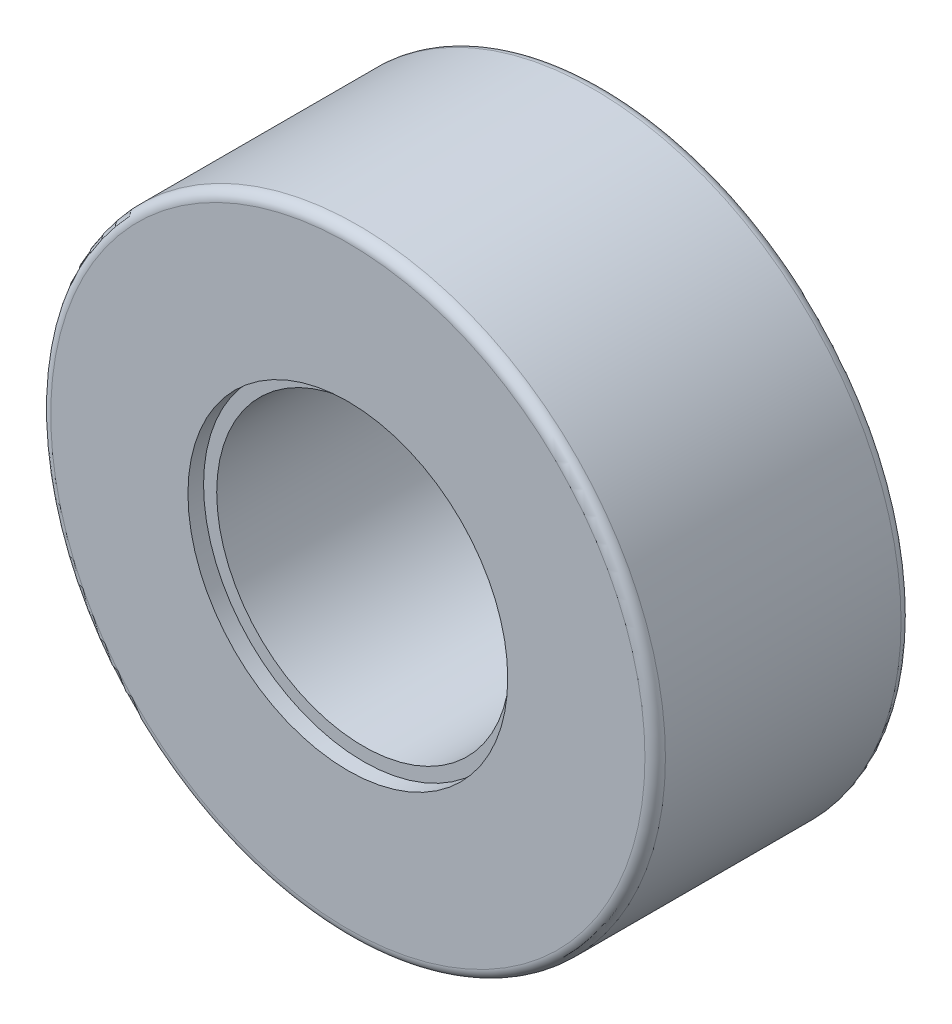
ISO-10303-21;
HEADER;
FILE_DESCRIPTION(('STEP AP214'),'2;1');
FILE_NAME('part.step','',(''),(''),'','','');
FILE_SCHEMA(('AUTOMOTIVE_DESIGN { 1 0 10303 214 1 1 1 1 }'));
ENDSEC;
DATA;
#1=APPLICATION_CONTEXT('core data for automotive mechanical design processes');
#2=APPLICATION_PROTOCOL_DEFINITION('international standard','automotive_design',2000,#1);
#3=PRODUCT_CONTEXT('',#1,'mechanical');
#4=PRODUCT('Part','Part','',(#3));
#5=PRODUCT_RELATED_PRODUCT_CATEGORY('part','',(#4));
#6=PRODUCT_DEFINITION_FORMATION('','',#4);
#7=PRODUCT_DEFINITION_CONTEXT('part definition',#1,'design');
#8=PRODUCT_DEFINITION('design','',#6,#7);
#9=PRODUCT_DEFINITION_SHAPE('','',#8);
#10=(LENGTH_UNIT() NAMED_UNIT(*) SI_UNIT(.MILLI.,.METRE.));
#11=(NAMED_UNIT(*) PLANE_ANGLE_UNIT() SI_UNIT($,.RADIAN.));
#12=(NAMED_UNIT(*) SI_UNIT($,.STERADIAN.) SOLID_ANGLE_UNIT());
#13=UNCERTAINTY_MEASURE_WITH_UNIT(LENGTH_MEASURE(1.E-05),#10,'distance_accuracy_value','');
#14=(GEOMETRIC_REPRESENTATION_CONTEXT(3) GLOBAL_UNCERTAINTY_ASSIGNED_CONTEXT((#13)) GLOBAL_UNIT_ASSIGNED_CONTEXT((#10,
#11,#12)) REPRESENTATION_CONTEXT('',''));
#15=CARTESIAN_POINT('',(0.,0.,0.));
#16=DIRECTION('',(0.,0.,1.));
#17=DIRECTION('',(1.,0.,0.));
#18=AXIS2_PLACEMENT_3D('',#15,#16,#17);
#19=CARTESIAN_POINT('',(0.,0.,12.5));
#20=DIRECTION('',(0.,0.,-1.));
#21=DIRECTION('',(-1.,0.,0.));
#22=AXIS2_PLACEMENT_3D('',#19,#20,#21);
#23=CYLINDRICAL_SURFACE('',#22,14.325);
#24=CARTESIAN_POINT('',(0.,0.,10.976));
#25=DIRECTION('',(0.,0.,1.));
#26=DIRECTION('',(1.,0.,0.));
#27=AXIS2_PLACEMENT_3D('',#24,#25,#26);
#28=CIRCLE('',#27,14.325);
#29=CARTESIAN_POINT('',(14.325,0.,10.976));
#30=VERTEX_POINT('',#29);
#31=EDGE_CURVE('E50',#30,#30,#28,.T.);
#32=ORIENTED_EDGE('',*,*,#31,.T.);
#33=EDGE_LOOP('',(#32));
#34=FACE_BOUND('',#33,.T.);
#35=CARTESIAN_POINT('',(0.,0.,-10.976));
#36=DIRECTION('',(0.,0.,-1.));
#37=DIRECTION('',(-1.,0.,0.));
#38=AXIS2_PLACEMENT_3D('',#35,#36,#37);
#39=CIRCLE('',#38,14.325);
#40=CARTESIAN_POINT('',(-14.325,0.,-10.976));
#41=VERTEX_POINT('',#40);
#42=EDGE_CURVE('E51',#41,#41,#39,.T.);
#43=ORIENTED_EDGE('',*,*,#42,.T.);
#44=EDGE_LOOP('',(#43));
#45=FACE_BOUND('',#44,.T.);
#46=ADVANCED_FACE('F30',(#34,#45),#23,.F.);
#47=CARTESIAN_POINT('',(0.,0.,12.5));
#48=DIRECTION('',(0.,0.,1.));
#49=DIRECTION('',(1.,0.,0.));
#50=AXIS2_PLACEMENT_3D('',#47,#48,#49);
#51=PLANE('',#50);
#52=CARTESIAN_POINT('',(0.,0.,12.5));
#53=DIRECTION('',(0.,0.,1.));
#54=DIRECTION('',(1.,0.,0.));
#55=AXIS2_PLACEMENT_3D('',#52,#53,#54);
#56=CIRCLE('',#55,29.);
#57=CARTESIAN_POINT('',(29.,0.,12.5));
#58=VERTEX_POINT('',#57);
#59=EDGE_CURVE('E10',#58,#58,#56,.T.);
#60=ORIENTED_EDGE('',*,*,#59,.T.);
#61=EDGE_LOOP('',(#60));
#62=FACE_BOUND('',#61,.T.);
#63=CARTESIAN_POINT('',(0.,0.,12.5));
#64=DIRECTION('',(0.,0.,1.));
#65=DIRECTION('',(1.,0.,0.));
#66=AXIS2_PLACEMENT_3D('',#63,#64,#65);
#67=CIRCLE('',#66,15.6075);
#68=CARTESIAN_POINT('',(15.6075,0.,12.5));
#69=VERTEX_POINT('',#68);
#70=EDGE_CURVE('E54',#69,#69,#67,.T.);
#71=ORIENTED_EDGE('',*,*,#70,.F.);
#72=EDGE_LOOP('',(#71));
#73=FACE_BOUND('',#72,.T.);
#74=ADVANCED_FACE('F86',(#62,#73),#51,.T.);
#75=CARTESIAN_POINT('',(0.,0.,-12.5));
#76=DIRECTION('',(0.,0.,1.));
#77=DIRECTION('',(1.,0.,0.));
#78=AXIS2_PLACEMENT_3D('',#75,#76,#77);
#79=PLANE('',#78);
#80=CARTESIAN_POINT('',(0.,0.,-12.5));
#81=DIRECTION('',(0.,0.,1.));
#82=DIRECTION('',(1.,0.,0.));
#83=AXIS2_PLACEMENT_3D('',#80,#81,#82);
#84=CIRCLE('',#83,29.);
#85=CARTESIAN_POINT('',(29.,0.,-12.5));
#86=VERTEX_POINT('',#85);
#87=EDGE_CURVE('E37',#86,#86,#84,.F.);
#88=ORIENTED_EDGE('',*,*,#87,.T.);
#89=EDGE_LOOP('',(#88));
#90=FACE_BOUND('',#89,.T.);
#91=CARTESIAN_POINT('',(0.,0.,-12.5));
#92=DIRECTION('',(0.,0.,1.));
#93=DIRECTION('',(1.,0.,0.));
#94=AXIS2_PLACEMENT_3D('',#91,#92,#93);
#95=CIRCLE('',#94,15.6075);
#96=CARTESIAN_POINT('',(-15.6075,0.,-12.5));
#97=VERTEX_POINT('',#96);
#98=EDGE_CURVE('E63',#97,#97,#95,.T.);
#99=ORIENTED_EDGE('',*,*,#98,.T.);
#100=EDGE_LOOP('',(#99));
#101=FACE_BOUND('',#100,.T.);
#102=ADVANCED_FACE('F92',(#90,#101),#79,.F.);
#103=CARTESIAN_POINT('',(0.,0.,12.5));
#104=DIRECTION('',(0.,0.,-1.));
#105=DIRECTION('',(-1.,0.,0.));
#106=AXIS2_PLACEMENT_3D('',#103,#104,#105);
#107=CYLINDRICAL_SURFACE('',#106,30.);
#108=CARTESIAN_POINT('',(0.,0.,-11.5));
#109=DIRECTION('',(0.,0.,1.));
#110=DIRECTION('',(1.,0.,0.));
#111=AXIS2_PLACEMENT_3D('',#108,#109,#110);
#112=CIRCLE('',#111,30.);
#113=CARTESIAN_POINT('',(30.,0.,-11.5));
#114=VERTEX_POINT('',#113);
#115=EDGE_CURVE('E41',#114,#114,#112,.T.);
#116=ORIENTED_EDGE('',*,*,#115,.T.);
#117=EDGE_LOOP('',(#116));
#118=FACE_BOUND('',#117,.T.);
#119=CARTESIAN_POINT('',(0.,0.,11.5));
#120=DIRECTION('',(0.,0.,1.));
#121=DIRECTION('',(1.,0.,0.));
#122=AXIS2_PLACEMENT_3D('',#119,#120,#121);
#123=CIRCLE('',#122,30.);
#124=CARTESIAN_POINT('',(30.,0.,11.5));
#125=VERTEX_POINT('',#124);
#126=EDGE_CURVE('E45',#125,#125,#123,.F.);
#127=ORIENTED_EDGE('',*,*,#126,.T.);
#128=EDGE_LOOP('',(#127));
#129=FACE_BOUND('',#128,.T.);
#130=ADVANCED_FACE('F101',(#118,#129),#107,.T.);
#131=CARTESIAN_POINT('',(0.,0.,10.976));
#132=DIRECTION('',(0.,0.,1.));
#133=DIRECTION('',(1.,0.,0.));
#134=AXIS2_PLACEMENT_3D('',#131,#132,#133);
#135=CYLINDRICAL_SURFACE('',#134,15.6075);
#136=CARTESIAN_POINT('',(0.,0.,10.976));
#137=DIRECTION('',(0.,0.,1.));
#138=DIRECTION('',(1.,0.,0.));
#139=AXIS2_PLACEMENT_3D('',#136,#137,#138);
#140=CIRCLE('',#139,15.6075);
#141=CARTESIAN_POINT('',(15.6075,0.,10.976));
#142=VERTEX_POINT('',#141);
#143=EDGE_CURVE('E58',#142,#142,#140,.T.);
#144=CARTESIAN_POINT('',(15.6075,0.,10.976));
#145=CARTESIAN_POINT('',(15.6075,0.,10.991875));
#146=CARTESIAN_POINT('',(15.6075,0.,11.00775));
#147=CARTESIAN_POINT('',(15.6075,0.,11.0395));
#148=CARTESIAN_POINT('',(15.6075,0.,11.055375));
#149=CARTESIAN_POINT('',(15.6075,0.,11.087125));
#150=CARTESIAN_POINT('',(15.6075,0.,11.103));
#151=CARTESIAN_POINT('',(15.6075,0.,11.13475));
#152=CARTESIAN_POINT('',(15.6075,0.,11.150625));
#153=CARTESIAN_POINT('',(15.6075,0.,11.182375));
#154=CARTESIAN_POINT('',(15.6075,0.,11.19825));
#155=CARTESIAN_POINT('',(15.6075,0.,11.23));
#156=CARTESIAN_POINT('',(15.6075,0.,11.245875));
#157=CARTESIAN_POINT('',(15.6075,0.,11.277625));
#158=CARTESIAN_POINT('',(15.6075,0.,11.2935));
#159=CARTESIAN_POINT('',(15.6075,0.,11.32525));
#160=CARTESIAN_POINT('',(15.6075,0.,11.341125));
#161=CARTESIAN_POINT('',(15.6075,0.,11.372875));
#162=CARTESIAN_POINT('',(15.6075,0.,11.38875));
#163=CARTESIAN_POINT('',(15.6075,0.,11.4205));
#164=CARTESIAN_POINT('',(15.6075,0.,11.436375));
#165=CARTESIAN_POINT('',(15.6075,0.,11.468125));
#166=CARTESIAN_POINT('',(15.6075,0.,11.484));
#167=CARTESIAN_POINT('',(15.6075,0.,11.51575));
#168=CARTESIAN_POINT('',(15.6075,0.,11.531625));
#169=CARTESIAN_POINT('',(15.6075,0.,11.563375));
#170=CARTESIAN_POINT('',(15.6075,0.,11.57925));
#171=CARTESIAN_POINT('',(15.6075,0.,11.611));
#172=CARTESIAN_POINT('',(15.6075,0.,11.626875));
#173=CARTESIAN_POINT('',(15.6075,0.,11.658625));
#174=CARTESIAN_POINT('',(15.6075,0.,11.6745));
#175=CARTESIAN_POINT('',(15.6075,0.,11.70625));
#176=CARTESIAN_POINT('',(15.6075,0.,11.722125));
#177=CARTESIAN_POINT('',(15.6075,0.,11.753875));
#178=CARTESIAN_POINT('',(15.6075,0.,11.76975));
#179=CARTESIAN_POINT('',(15.6075,0.,11.8015));
#180=CARTESIAN_POINT('',(15.6075,0.,11.817375));
#181=CARTESIAN_POINT('',(15.6075,0.,11.849125));
#182=CARTESIAN_POINT('',(15.6075,0.,11.865));
#183=CARTESIAN_POINT('',(15.6075,0.,11.89675));
#184=CARTESIAN_POINT('',(15.6075,0.,11.912625));
#185=CARTESIAN_POINT('',(15.6075,0.,11.944375));
#186=CARTESIAN_POINT('',(15.6075,0.,11.96025));
#187=CARTESIAN_POINT('',(15.6075,0.,11.992));
#188=CARTESIAN_POINT('',(15.6075,0.,12.007875));
#189=CARTESIAN_POINT('',(15.6075,0.,12.039625));
#190=CARTESIAN_POINT('',(15.6075,0.,12.0555));
#191=CARTESIAN_POINT('',(15.6075,0.,12.08725));
#192=CARTESIAN_POINT('',(15.6075,0.,12.103125));
#193=CARTESIAN_POINT('',(15.6075,0.,12.134875));
#194=CARTESIAN_POINT('',(15.6075,0.,12.15075));
#195=CARTESIAN_POINT('',(15.6075,0.,12.1825));
#196=CARTESIAN_POINT('',(15.6075,0.,12.198375));
#197=CARTESIAN_POINT('',(15.6075,0.,12.230125));
#198=CARTESIAN_POINT('',(15.6075,0.,12.246));
#199=CARTESIAN_POINT('',(15.6075,0.,12.27775));
#200=CARTESIAN_POINT('',(15.6075,0.,12.293625));
#201=CARTESIAN_POINT('',(15.6075,0.,12.325375));
#202=CARTESIAN_POINT('',(15.6075,0.,12.34125));
#203=CARTESIAN_POINT('',(15.6075,0.,12.373));
#204=CARTESIAN_POINT('',(15.6075,0.,12.388875));
#205=CARTESIAN_POINT('',(15.6075,0.,12.420625));
#206=CARTESIAN_POINT('',(15.6075,0.,12.4365));
#207=CARTESIAN_POINT('',(15.6075,0.,12.46825));
#208=CARTESIAN_POINT('',(15.6075,0.,12.484125));
#209=CARTESIAN_POINT('',(15.6075,0.,12.5));
#210=B_SPLINE_CURVE_WITH_KNOTS('',3,(#144,#145,#146,#147,#148,#149,#150,#151,#152,#153,#154,
#155,#156,#157,#158,#159,#160,#161,#162,#163,#164,#165,#166,#167,#168,#169,#170,#171,#172,#173,
#174,#175,#176,#177,#178,#179,#180,#181,#182,#183,#184,#185,#186,#187,#188,#189,#190,#191,#192,
#193,#194,#195,#196,#197,#198,#199,#200,#201,#202,#203,#204,#205,#206,#207,#208,#209),
.UNSPECIFIED.,.F.,.F.,(4,2,2,2,2,2,2,2,2,2,2,2,2,2,2,2,2,2,2,2,2,2,2,2,2,2,2,2,2,2,2,2,4),(0.,
0.0476249999999991,0.0952499999999998,0.142874999999999,0.1905,0.238124999999999,0.28575,
0.333374999999999,0.380999999999999,0.428624999999998,0.476249999999999,0.523874999999998,
0.571499999999999,0.619124999999998,0.666749999999999,0.714374999999998,0.761999999999999,
0.809624999999998,0.857249999999999,0.904874999999999,0.952499999999998,1.000125,1.04775,
1.095375,1.143,1.190625,1.23825,1.285875,1.3335,1.381125,1.42875,1.476375,1.524),.UNSPECIFIED.);
#211=EDGE_CURVE('BSEAM96',#142,#69,#210,.T.);
#212=ORIENTED_EDGE('',*,*,#143,.F.);
#213=ORIENTED_EDGE('',*,*,#70,.T.);
#214=ORIENTED_EDGE('',*,*,#211,.T.);
#215=ORIENTED_EDGE('',*,*,#211,.F.);
#216=EDGE_LOOP('',(#212,#214,#213,#215));
#217=FACE_BOUND('',#216,.T.);
#218=ADVANCED_FACE('F96',(#217),#135,.F.);
#219=CARTESIAN_POINT('',(0.,0.,10.976));
#220=DIRECTION('',(0.,0.,1.));
#221=DIRECTION('',(1.,0.,0.));
#222=AXIS2_PLACEMENT_3D('',#219,#220,#221);
#223=PLANE('',#222);
#224=ORIENTED_EDGE('',*,*,#31,.F.);
#225=EDGE_LOOP('',(#224));
#226=FACE_BOUND('',#225,.T.);
#227=ORIENTED_EDGE('',*,*,#143,.T.);
#228=EDGE_LOOP('',(#227));
#229=FACE_BOUND('',#228,.T.);
#230=ADVANCED_FACE('F82',(#226,#229),#223,.T.);
#231=CARTESIAN_POINT('',(0.,0.,-10.976));
#232=DIRECTION('',(0.,0.,-1.));
#233=DIRECTION('',(-1.,0.,0.));
#234=AXIS2_PLACEMENT_3D('',#231,#232,#233);
#235=CYLINDRICAL_SURFACE('',#234,15.6075);
#236=CARTESIAN_POINT('',(0.,0.,-10.976));
#237=DIRECTION('',(0.,0.,1.));
#238=DIRECTION('',(1.,0.,0.));
#239=AXIS2_PLACEMENT_3D('',#236,#237,#238);
#240=CIRCLE('',#239,15.6075);
#241=CARTESIAN_POINT('',(-15.6075,0.,-10.976));
#242=VERTEX_POINT('',#241);
#243=EDGE_CURVE('E55',#242,#242,#240,.T.);
#244=CARTESIAN_POINT('',(-15.6075,0.,-10.976));
#245=CARTESIAN_POINT('',(-15.6075,0.,-10.991875));
#246=CARTESIAN_POINT('',(-15.6075,0.,-11.00775));
#247=CARTESIAN_POINT('',(-15.6075,0.,-11.0395));
#248=CARTESIAN_POINT('',(-15.6075,0.,-11.055375));
#249=CARTESIAN_POINT('',(-15.6075,0.,-11.087125));
#250=CARTESIAN_POINT('',(-15.6075,0.,-11.103));
#251=CARTESIAN_POINT('',(-15.6075,0.,-11.13475));
#252=CARTESIAN_POINT('',(-15.6075,0.,-11.150625));
#253=CARTESIAN_POINT('',(-15.6075,0.,-11.182375));
#254=CARTESIAN_POINT('',(-15.6075,0.,-11.19825));
#255=CARTESIAN_POINT('',(-15.6075,0.,-11.23));
#256=CARTESIAN_POINT('',(-15.6075,0.,-11.245875));
#257=CARTESIAN_POINT('',(-15.6075,0.,-11.277625));
#258=CARTESIAN_POINT('',(-15.6075,0.,-11.2935));
#259=CARTESIAN_POINT('',(-15.6075,0.,-11.32525));
#260=CARTESIAN_POINT('',(-15.6075,0.,-11.341125));
#261=CARTESIAN_POINT('',(-15.6075,0.,-11.372875));
#262=CARTESIAN_POINT('',(-15.6075,0.,-11.38875));
#263=CARTESIAN_POINT('',(-15.6075,0.,-11.4205));
#264=CARTESIAN_POINT('',(-15.6075,0.,-11.436375));
#265=CARTESIAN_POINT('',(-15.6075,0.,-11.468125));
#266=CARTESIAN_POINT('',(-15.6075,0.,-11.484));
#267=CARTESIAN_POINT('',(-15.6075,0.,-11.51575));
#268=CARTESIAN_POINT('',(-15.6075,0.,-11.531625));
#269=CARTESIAN_POINT('',(-15.6075,0.,-11.563375));
#270=CARTESIAN_POINT('',(-15.6075,0.,-11.57925));
#271=CARTESIAN_POINT('',(-15.6075,0.,-11.611));
#272=CARTESIAN_POINT('',(-15.6075,0.,-11.626875));
#273=CARTESIAN_POINT('',(-15.6075,0.,-11.658625));
#274=CARTESIAN_POINT('',(-15.6075,0.,-11.6745));
#275=CARTESIAN_POINT('',(-15.6075,0.,-11.70625));
#276=CARTESIAN_POINT('',(-15.6075,0.,-11.722125));
#277=CARTESIAN_POINT('',(-15.6075,0.,-11.753875));
#278=CARTESIAN_POINT('',(-15.6075,0.,-11.76975));
#279=CARTESIAN_POINT('',(-15.6075,0.,-11.8015));
#280=CARTESIAN_POINT('',(-15.6075,0.,-11.817375));
#281=CARTESIAN_POINT('',(-15.6075,0.,-11.849125));
#282=CARTESIAN_POINT('',(-15.6075,0.,-11.865));
#283=CARTESIAN_POINT('',(-15.6075,0.,-11.89675));
#284=CARTESIAN_POINT('',(-15.6075,0.,-11.912625));
#285=CARTESIAN_POINT('',(-15.6075,0.,-11.944375));
#286=CARTESIAN_POINT('',(-15.6075,0.,-11.96025));
#287=CARTESIAN_POINT('',(-15.6075,0.,-11.992));
#288=CARTESIAN_POINT('',(-15.6075,0.,-12.007875));
#289=CARTESIAN_POINT('',(-15.6075,0.,-12.039625));
#290=CARTESIAN_POINT('',(-15.6075,0.,-12.0555));
#291=CARTESIAN_POINT('',(-15.6075,0.,-12.08725));
#292=CARTESIAN_POINT('',(-15.6075,0.,-12.103125));
#293=CARTESIAN_POINT('',(-15.6075,0.,-12.134875));
#294=CARTESIAN_POINT('',(-15.6075,0.,-12.15075));
#295=CARTESIAN_POINT('',(-15.6075,0.,-12.1825));
#296=CARTESIAN_POINT('',(-15.6075,0.,-12.198375));
#297=CARTESIAN_POINT('',(-15.6075,0.,-12.230125));
#298=CARTESIAN_POINT('',(-15.6075,0.,-12.246));
#299=CARTESIAN_POINT('',(-15.6075,0.,-12.27775));
#300=CARTESIAN_POINT('',(-15.6075,0.,-12.293625));
#301=CARTESIAN_POINT('',(-15.6075,0.,-12.325375));
#302=CARTESIAN_POINT('',(-15.6075,0.,-12.34125));
#303=CARTESIAN_POINT('',(-15.6075,0.,-12.373));
#304=CARTESIAN_POINT('',(-15.6075,0.,-12.388875));
#305=CARTESIAN_POINT('',(-15.6075,0.,-12.420625));
#306=CARTESIAN_POINT('',(-15.6075,0.,-12.4365));
#307=CARTESIAN_POINT('',(-15.6075,0.,-12.46825));
#308=CARTESIAN_POINT('',(-15.6075,0.,-12.484125));
#309=CARTESIAN_POINT('',(-15.6075,0.,-12.5));
#310=B_SPLINE_CURVE_WITH_KNOTS('',3,(#244,#245,#246,#247,#248,#249,#250,#251,#252,#253,#254,
#255,#256,#257,#258,#259,#260,#261,#262,#263,#264,#265,#266,#267,#268,#269,#270,#271,#272,#273,
#274,#275,#276,#277,#278,#279,#280,#281,#282,#283,#284,#285,#286,#287,#288,#289,#290,#291,#292,
#293,#294,#295,#296,#297,#298,#299,#300,#301,#302,#303,#304,#305,#306,#307,#308,#309),
.UNSPECIFIED.,.F.,.F.,(4,2,2,2,2,2,2,2,2,2,2,2,2,2,2,2,2,2,2,2,2,2,2,2,2,2,2,2,2,2,2,2,4),(0.,
0.0476250000000008,0.0952500000000016,0.142875000000001,0.190500000000001,0.238125,
0.285750000000001,0.333375,0.381000000000001,0.428625,0.476250000000001,0.523875,
0.571500000000001,0.619125,0.666750000000001,0.714375000000001,0.762000000000001,
0.809625000000001,0.85725,0.904875000000001,0.9525,1.000125,1.04775,1.095375,1.143,1.190625,
1.23825,1.285875,1.3335,1.381125,1.42875,1.476375,1.524),.UNSPECIFIED.);
#311=EDGE_CURVE('BSEAM69',#242,#97,#310,.T.);
#312=ORIENTED_EDGE('',*,*,#243,.T.);
#313=ORIENTED_EDGE('',*,*,#98,.F.);
#314=ORIENTED_EDGE('',*,*,#311,.T.);
#315=ORIENTED_EDGE('',*,*,#311,.F.);
#316=EDGE_LOOP('',(#312,#314,#313,#315));
#317=FACE_BOUND('',#316,.T.);
#318=ADVANCED_FACE('F69',(#317),#235,.F.);
#319=CARTESIAN_POINT('',(0.,0.,-10.976));
#320=DIRECTION('',(0.,0.,-1.));
#321=DIRECTION('',(1.,0.,0.));
#322=AXIS2_PLACEMENT_3D('',#319,#320,#321);
#323=PLANE('',#322);
#324=ORIENTED_EDGE('',*,*,#42,.F.);
#325=EDGE_LOOP('',(#324));
#326=FACE_BOUND('',#325,.T.);
#327=ORIENTED_EDGE('',*,*,#243,.F.);
#328=EDGE_LOOP('',(#327));
#329=FACE_BOUND('',#328,.T.);
#330=ADVANCED_FACE('F72',(#326,#329),#323,.T.);
#331=CARTESIAN_POINT('',(0.,0.,-11.5));
#332=DIRECTION('',(0.,0.,1.));
#333=DIRECTION('',(1.,0.,0.));
#334=AXIS2_PLACEMENT_3D('',#331,#332,#333);
#335=TOROIDAL_SURFACE('',#334,29.,1.);
#336=ORIENTED_EDGE('',*,*,#87,.F.);
#337=EDGE_LOOP('',(#336));
#338=FACE_BOUND('',#337,.T.);
#339=ORIENTED_EDGE('',*,*,#115,.F.);
#340=EDGE_LOOP('',(#339));
#341=FACE_BOUND('',#340,.T.);
#342=ADVANCED_FACE('F74',(#338,#341),#335,.T.);
#343=CARTESIAN_POINT('',(0.,0.,11.5));
#344=DIRECTION('',(0.,0.,1.));
#345=DIRECTION('',(1.,0.,0.));
#346=AXIS2_PLACEMENT_3D('',#343,#344,#345);
#347=TOROIDAL_SURFACE('',#346,29.,1.);
#348=ORIENTED_EDGE('',*,*,#126,.F.);
#349=EDGE_LOOP('',(#348));
#350=FACE_BOUND('',#349,.T.);
#351=ORIENTED_EDGE('',*,*,#59,.F.);
#352=EDGE_LOOP('',(#351));
#353=FACE_BOUND('',#352,.T.);
#354=ADVANCED_FACE('F32',(#350,#353),#347,.T.);
#355=CLOSED_SHELL('',(#46,#74,#102,#130,#218,#230,#318,#330,#342,#354));
#356=MANIFOLD_SOLID_BREP('B2',#355);
#357=ADVANCED_BREP_SHAPE_REPRESENTATION('',(#18,#356),#14);
#358=SHAPE_DEFINITION_REPRESENTATION(#9,#357);
ENDSEC;
END-ISO-10303-21;
